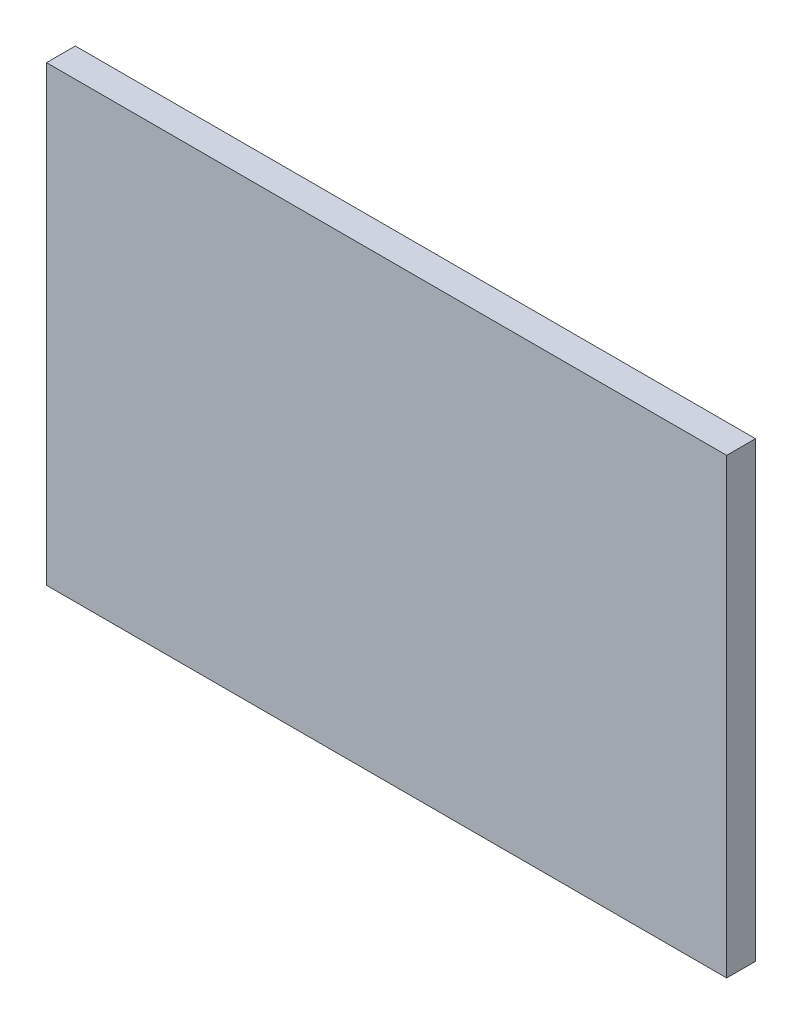
ISO-10303-21;
HEADER;
FILE_DESCRIPTION(('STEP AP214'),'2;1');
FILE_NAME('part.step','',(''),(''),'','','');
FILE_SCHEMA(('AUTOMOTIVE_DESIGN { 1 0 10303 214 1 1 1 1 }'));
ENDSEC;
DATA;
#1=APPLICATION_CONTEXT('core data for automotive mechanical design processes');
#2=APPLICATION_PROTOCOL_DEFINITION('international standard','automotive_design',2000,#1);
#3=PRODUCT_CONTEXT('',#1,'mechanical');
#4=PRODUCT('Part','Part','',(#3));
#5=PRODUCT_RELATED_PRODUCT_CATEGORY('part','',(#4));
#6=PRODUCT_DEFINITION_FORMATION('','',#4);
#7=PRODUCT_DEFINITION_CONTEXT('part definition',#1,'design');
#8=PRODUCT_DEFINITION('design','',#6,#7);
#9=PRODUCT_DEFINITION_SHAPE('','',#8);
#10=(LENGTH_UNIT() NAMED_UNIT(*) SI_UNIT(.MILLI.,.METRE.));
#11=(NAMED_UNIT(*) PLANE_ANGLE_UNIT() SI_UNIT($,.RADIAN.));
#12=(NAMED_UNIT(*) SI_UNIT($,.STERADIAN.) SOLID_ANGLE_UNIT());
#13=UNCERTAINTY_MEASURE_WITH_UNIT(LENGTH_MEASURE(1.E-05),#10,'distance_accuracy_value','');
#14=(GEOMETRIC_REPRESENTATION_CONTEXT(3) GLOBAL_UNCERTAINTY_ASSIGNED_CONTEXT((#13)) GLOBAL_UNIT_ASSIGNED_CONTEXT((#10,
#11,#12)) REPRESENTATION_CONTEXT('',''));
#15=CARTESIAN_POINT('',(0.,0.,0.));
#16=DIRECTION('',(0.,0.,1.));
#17=DIRECTION('',(1.,0.,0.));
#18=AXIS2_PLACEMENT_3D('',#15,#16,#17);
#19=CARTESIAN_POINT('',(-42.48,-28.27,3.6));
#20=DIRECTION('',(1.,0.,0.));
#21=DIRECTION('',(0.,0.,-1.));
#22=AXIS2_PLACEMENT_3D('',#19,#20,#21);
#23=PLANE('',#22);
#24=DIRECTION('',(0.,-1.,0.));
#25=VECTOR('',#24,1.);
#26=CARTESIAN_POINT('',(-42.48,-28.27,0.));
#27=LINE('',#26,#25);
#28=CARTESIAN_POINT('',(-42.48,28.27,0.));
#29=VERTEX_POINT('',#28);
#30=CARTESIAN_POINT('',(-42.48,-28.27,0.));
#31=VERTEX_POINT('',#30);
#32=EDGE_CURVE('E98',#29,#31,#27,.T.);
#33=ORIENTED_EDGE('',*,*,#32,.T.);
#34=DIRECTION('',(0.,0.,-1.));
#35=VECTOR('',#34,1.);
#36=CARTESIAN_POINT('',(-42.48,-28.27,3.6));
#37=LINE('',#36,#35);
#38=CARTESIAN_POINT('',(-42.48,-28.27,3.6));
#39=VERTEX_POINT('',#38);
#40=EDGE_CURVE('E11',#39,#31,#37,.T.);
#41=ORIENTED_EDGE('',*,*,#40,.F.);
#42=DIRECTION('',(0.,-1.,0.));
#43=VECTOR('',#42,1.);
#44=CARTESIAN_POINT('',(-42.48,-28.27,3.6));
#45=LINE('',#44,#43);
#46=CARTESIAN_POINT('',(-42.48,28.27,3.6));
#47=VERTEX_POINT('',#46);
#48=EDGE_CURVE('E86',#47,#39,#45,.T.);
#49=ORIENTED_EDGE('',*,*,#48,.F.);
#50=DIRECTION('',(0.,0.,-1.));
#51=VECTOR('',#50,1.);
#52=CARTESIAN_POINT('',(-42.48,28.27,3.6));
#53=LINE('',#52,#51);
#54=EDGE_CURVE('E94',#47,#29,#53,.T.);
#55=ORIENTED_EDGE('',*,*,#54,.T.);
#56=EDGE_LOOP('',(#33,#41,#49,#55));
#57=FACE_BOUND('',#56,.T.);
#58=ADVANCED_FACE('F35',(#57),#23,.F.);
#59=CARTESIAN_POINT('',(42.48,-28.27,3.6));
#60=DIRECTION('',(0.,1.,0.));
#61=DIRECTION('',(-1.,0.,0.));
#62=AXIS2_PLACEMENT_3D('',#59,#60,#61);
#63=PLANE('',#62);
#64=DIRECTION('',(1.,0.,0.));
#65=VECTOR('',#64,1.);
#66=CARTESIAN_POINT('',(42.48,-28.27,0.));
#67=LINE('',#66,#65);
#68=CARTESIAN_POINT('',(42.48,-28.27,0.));
#69=VERTEX_POINT('',#68);
#70=EDGE_CURVE('E90',#31,#69,#67,.T.);
#71=ORIENTED_EDGE('',*,*,#70,.T.);
#72=DIRECTION('',(0.,0.,-1.));
#73=VECTOR('',#72,1.);
#74=CARTESIAN_POINT('',(42.48,-28.27,3.6));
#75=LINE('',#74,#73);
#76=CARTESIAN_POINT('',(42.48,-28.27,3.6));
#77=VERTEX_POINT('',#76);
#78=EDGE_CURVE('E43',#77,#69,#75,.T.);
#79=ORIENTED_EDGE('',*,*,#78,.F.);
#80=DIRECTION('',(1.,0.,0.));
#81=VECTOR('',#80,1.);
#82=CARTESIAN_POINT('',(42.48,-28.27,3.6));
#83=LINE('',#82,#81);
#84=EDGE_CURVE('E81',#39,#77,#83,.T.);
#85=ORIENTED_EDGE('',*,*,#84,.F.);
#86=ORIENTED_EDGE('',*,*,#40,.T.);
#87=EDGE_LOOP('',(#71,#79,#85,#86));
#88=FACE_BOUND('',#87,.T.);
#89=ADVANCED_FACE('F89',(#88),#63,.F.);
#90=CARTESIAN_POINT('',(42.48,-28.27,3.6));
#91=DIRECTION('',(-1.,0.,0.));
#92=DIRECTION('',(0.,0.,1.));
#93=AXIS2_PLACEMENT_3D('',#90,#91,#92);
#94=PLANE('',#93);
#95=DIRECTION('',(0.,1.,0.));
#96=VECTOR('',#95,1.);
#97=CARTESIAN_POINT('',(42.48,-28.27,0.));
#98=LINE('',#97,#96);
#99=CARTESIAN_POINT('',(42.48,28.27,0.));
#100=VERTEX_POINT('',#99);
#101=EDGE_CURVE('E68',#69,#100,#98,.T.);
#102=ORIENTED_EDGE('',*,*,#101,.T.);
#103=DIRECTION('',(0.,0.,-1.));
#104=VECTOR('',#103,1.);
#105=CARTESIAN_POINT('',(42.48,28.27,3.6));
#106=LINE('',#105,#104);
#107=CARTESIAN_POINT('',(42.48,28.27,3.6));
#108=VERTEX_POINT('',#107);
#109=EDGE_CURVE('E91',#108,#100,#106,.T.);
#110=ORIENTED_EDGE('',*,*,#109,.F.);
#111=DIRECTION('',(0.,1.,0.));
#112=VECTOR('',#111,1.);
#113=CARTESIAN_POINT('',(42.48,-28.27,3.6));
#114=LINE('',#113,#112);
#115=EDGE_CURVE('E84',#77,#108,#114,.T.);
#116=ORIENTED_EDGE('',*,*,#115,.F.);
#117=ORIENTED_EDGE('',*,*,#78,.T.);
#118=EDGE_LOOP('',(#102,#110,#116,#117));
#119=FACE_BOUND('',#118,.T.);
#120=ADVANCED_FACE('F92',(#119),#94,.F.);
#121=CARTESIAN_POINT('',(42.48,28.27,3.6));
#122=DIRECTION('',(0.,-1.,0.));
#123=DIRECTION('',(1.,0.,0.));
#124=AXIS2_PLACEMENT_3D('',#121,#122,#123);
#125=PLANE('',#124);
#126=DIRECTION('',(-1.,0.,0.));
#127=VECTOR('',#126,1.);
#128=CARTESIAN_POINT('',(42.48,28.27,0.));
#129=LINE('',#128,#127);
#130=EDGE_CURVE('E74',#100,#29,#129,.T.);
#131=ORIENTED_EDGE('',*,*,#130,.T.);
#132=ORIENTED_EDGE('',*,*,#54,.F.);
#133=DIRECTION('',(-1.,0.,0.));
#134=VECTOR('',#133,1.);
#135=CARTESIAN_POINT('',(42.48,28.27,3.6));
#136=LINE('',#135,#134);
#137=EDGE_CURVE('E51',#108,#47,#136,.T.);
#138=ORIENTED_EDGE('',*,*,#137,.F.);
#139=ORIENTED_EDGE('',*,*,#109,.T.);
#140=EDGE_LOOP('',(#131,#132,#138,#139));
#141=FACE_BOUND('',#140,.T.);
#142=ADVANCED_FACE('F105',(#141),#125,.F.);
#143=CARTESIAN_POINT('',(0.,0.,3.6));
#144=DIRECTION('',(0.,0.,1.));
#145=DIRECTION('',(1.,0.,0.));
#146=AXIS2_PLACEMENT_3D('',#143,#144,#145);
#147=PLANE('',#146);
#148=ORIENTED_EDGE('',*,*,#48,.T.);
#149=ORIENTED_EDGE('',*,*,#84,.T.);
#150=ORIENTED_EDGE('',*,*,#115,.T.);
#151=ORIENTED_EDGE('',*,*,#137,.T.);
#152=EDGE_LOOP('',(#148,#149,#150,#151));
#153=FACE_BOUND('',#152,.T.);
#154=ADVANCED_FACE('F82',(#153),#147,.T.);
#155=CARTESIAN_POINT('',(0.,0.,0.));
#156=DIRECTION('',(0.,0.,1.));
#157=DIRECTION('',(1.,0.,0.));
#158=AXIS2_PLACEMENT_3D('',#155,#156,#157);
#159=PLANE('',#158);
#160=ORIENTED_EDGE('',*,*,#32,.F.);
#161=ORIENTED_EDGE('',*,*,#130,.F.);
#162=ORIENTED_EDGE('',*,*,#101,.F.);
#163=ORIENTED_EDGE('',*,*,#70,.F.);
#164=EDGE_LOOP('',(#160,#161,#162,#163));
#165=FACE_BOUND('',#164,.T.);
#166=ADVANCED_FACE('F108',(#165),#159,.F.);
#167=CLOSED_SHELL('',(#58,#89,#120,#142,#154,#166));
#168=MANIFOLD_SOLID_BREP('B2',#167);
#169=ADVANCED_BREP_SHAPE_REPRESENTATION('',(#18,#168),#14);
#170=SHAPE_DEFINITION_REPRESENTATION(#9,#169);
ENDSEC;
END-ISO-10303-21;
